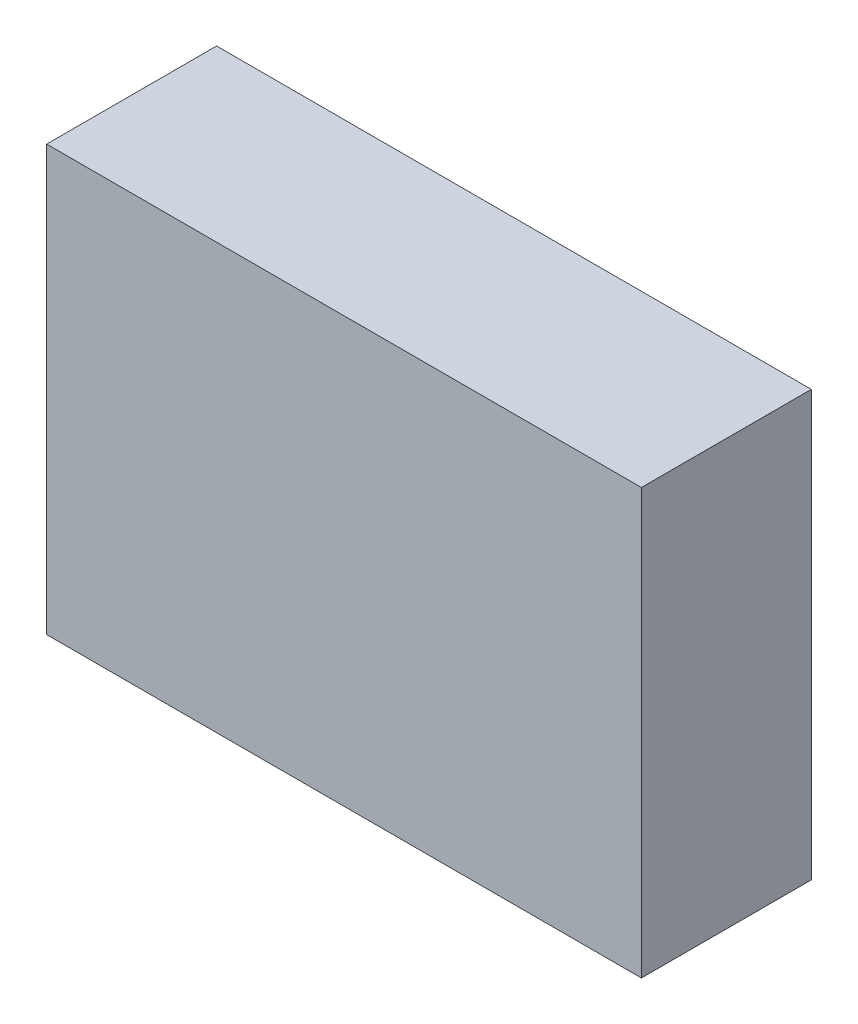
ISO-10303-21;
HEADER;
FILE_DESCRIPTION(('STEP AP214'),'2;1');
FILE_NAME('part.step','',(''),(''),'','','');
FILE_SCHEMA(('AUTOMOTIVE_DESIGN { 1 0 10303 214 1 1 1 1 }'));
ENDSEC;
DATA;
#1=APPLICATION_CONTEXT('core data for automotive mechanical design processes');
#2=APPLICATION_PROTOCOL_DEFINITION('international standard','automotive_design',2000,#1);
#3=PRODUCT_CONTEXT('',#1,'mechanical');
#4=PRODUCT('Part','Part','',(#3));
#5=PRODUCT_RELATED_PRODUCT_CATEGORY('part','',(#4));
#6=PRODUCT_DEFINITION_FORMATION('','',#4);
#7=PRODUCT_DEFINITION_CONTEXT('part definition',#1,'design');
#8=PRODUCT_DEFINITION('design','',#6,#7);
#9=PRODUCT_DEFINITION_SHAPE('','',#8);
#10=(LENGTH_UNIT() NAMED_UNIT(*) SI_UNIT(.MILLI.,.METRE.));
#11=(NAMED_UNIT(*) PLANE_ANGLE_UNIT() SI_UNIT($,.RADIAN.));
#12=(NAMED_UNIT(*) SI_UNIT($,.STERADIAN.) SOLID_ANGLE_UNIT());
#13=UNCERTAINTY_MEASURE_WITH_UNIT(LENGTH_MEASURE(1.E-05),#10,'distance_accuracy_value','');
#14=(GEOMETRIC_REPRESENTATION_CONTEXT(3) GLOBAL_UNCERTAINTY_ASSIGNED_CONTEXT((#13)) GLOBAL_UNIT_ASSIGNED_CONTEXT((#10,
#11,#12)) REPRESENTATION_CONTEXT('',''));
#15=CARTESIAN_POINT('',(0.,0.,0.));
#16=DIRECTION('',(0.,0.,1.));
#17=DIRECTION('',(1.,0.,0.));
#18=AXIS2_PLACEMENT_3D('',#15,#16,#17);
#19=CARTESIAN_POINT('',(35.,-25.,20.));
#20=DIRECTION('',(-1.,0.,0.));
#21=DIRECTION('',(0.,0.,1.));
#22=AXIS2_PLACEMENT_3D('',#19,#20,#21);
#23=PLANE('',#22);
#24=DIRECTION('',(0.,1.,0.));
#25=VECTOR('',#24,1.);
#26=CARTESIAN_POINT('',(35.,-25.,0.));
#27=LINE('',#26,#25);
#28=CARTESIAN_POINT('',(35.,-25.,0.));
#29=VERTEX_POINT('',#28);
#30=CARTESIAN_POINT('',(35.,25.,0.));
#31=VERTEX_POINT('',#30);
#32=EDGE_CURVE('E113',#29,#31,#27,.T.);
#33=ORIENTED_EDGE('',*,*,#32,.T.);
#34=DIRECTION('',(0.,0.,-1.));
#35=VECTOR('',#34,1.);
#36=CARTESIAN_POINT('',(35.,25.,20.));
#37=LINE('',#36,#35);
#38=CARTESIAN_POINT('',(35.,25.,20.));
#39=VERTEX_POINT('',#38);
#40=EDGE_CURVE('E11',#39,#31,#37,.T.);
#41=ORIENTED_EDGE('',*,*,#40,.F.);
#42=DIRECTION('',(0.,1.,0.));
#43=VECTOR('',#42,1.);
#44=CARTESIAN_POINT('',(35.,-25.,20.));
#45=LINE('',#44,#43);
#46=CARTESIAN_POINT('',(35.,-25.,20.));
#47=VERTEX_POINT('',#46);
#48=EDGE_CURVE('E97',#47,#39,#45,.T.);
#49=ORIENTED_EDGE('',*,*,#48,.F.);
#50=DIRECTION('',(0.,0.,-1.));
#51=VECTOR('',#50,1.);
#52=CARTESIAN_POINT('',(35.,-25.,20.));
#53=LINE('',#52,#51);
#54=EDGE_CURVE('E109',#47,#29,#53,.T.);
#55=ORIENTED_EDGE('',*,*,#54,.T.);
#56=EDGE_LOOP('',(#33,#41,#49,#55));
#57=FACE_BOUND('',#56,.T.);
#58=ADVANCED_FACE('F45',(#57),#23,.F.);
#59=CARTESIAN_POINT('',(-35.,25.,20.));
#60=DIRECTION('',(0.,-1.,0.));
#61=DIRECTION('',(0.,0.,-1.));
#62=AXIS2_PLACEMENT_3D('',#59,#60,#61);
#63=PLANE('',#62);
#64=DIRECTION('',(-1.,0.,0.));
#65=VECTOR('',#64,1.);
#66=CARTESIAN_POINT('',(-35.,25.,0.));
#67=LINE('',#66,#65);
#68=CARTESIAN_POINT('',(-35.,25.,0.));
#69=VERTEX_POINT('',#68);
#70=EDGE_CURVE('E102',#31,#69,#67,.T.);
#71=ORIENTED_EDGE('',*,*,#70,.T.);
#72=DIRECTION('',(0.,0.,-1.));
#73=VECTOR('',#72,1.);
#74=CARTESIAN_POINT('',(-35.,25.,20.));
#75=LINE('',#74,#73);
#76=CARTESIAN_POINT('',(-35.,25.,20.));
#77=VERTEX_POINT('',#76);
#78=EDGE_CURVE('E54',#77,#69,#75,.T.);
#79=ORIENTED_EDGE('',*,*,#78,.F.);
#80=DIRECTION('',(-1.,0.,0.));
#81=VECTOR('',#80,1.);
#82=CARTESIAN_POINT('',(-35.,25.,20.));
#83=LINE('',#82,#81);
#84=EDGE_CURVE('E92',#39,#77,#83,.T.);
#85=ORIENTED_EDGE('',*,*,#84,.F.);
#86=ORIENTED_EDGE('',*,*,#40,.T.);
#87=EDGE_LOOP('',(#71,#79,#85,#86));
#88=FACE_BOUND('',#87,.T.);
#89=ADVANCED_FACE('F101',(#88),#63,.F.);
#90=CARTESIAN_POINT('',(-35.,-25.,20.));
#91=DIRECTION('',(1.,0.,0.));
#92=DIRECTION('',(0.,0.,-1.));
#93=AXIS2_PLACEMENT_3D('',#90,#91,#92);
#94=PLANE('',#93);
#95=DIRECTION('',(0.,-1.,0.));
#96=VECTOR('',#95,1.);
#97=CARTESIAN_POINT('',(-35.,-25.,0.));
#98=LINE('',#97,#96);
#99=CARTESIAN_POINT('',(-35.,-25.,0.));
#100=VERTEX_POINT('',#99);
#101=EDGE_CURVE('E79',#69,#100,#98,.T.);
#102=ORIENTED_EDGE('',*,*,#101,.T.);
#103=DIRECTION('',(0.,0.,-1.));
#104=VECTOR('',#103,1.);
#105=CARTESIAN_POINT('',(-35.,-25.,20.));
#106=LINE('',#105,#104);
#107=CARTESIAN_POINT('',(-35.,-25.,20.));
#108=VERTEX_POINT('',#107);
#109=EDGE_CURVE('E104',#108,#100,#106,.T.);
#110=ORIENTED_EDGE('',*,*,#109,.F.);
#111=DIRECTION('',(0.,-1.,0.));
#112=VECTOR('',#111,1.);
#113=CARTESIAN_POINT('',(-35.,-25.,20.));
#114=LINE('',#113,#112);
#115=EDGE_CURVE('E95',#77,#108,#114,.T.);
#116=ORIENTED_EDGE('',*,*,#115,.F.);
#117=ORIENTED_EDGE('',*,*,#78,.T.);
#118=EDGE_LOOP('',(#102,#110,#116,#117));
#119=FACE_BOUND('',#118,.T.);
#120=ADVANCED_FACE('F105',(#119),#94,.F.);
#121=CARTESIAN_POINT('',(-35.,-25.,20.));
#122=DIRECTION('',(0.,1.,0.));
#123=DIRECTION('',(0.,0.,1.));
#124=AXIS2_PLACEMENT_3D('',#121,#122,#123);
#125=PLANE('',#124);
#126=DIRECTION('',(1.,0.,0.));
#127=VECTOR('',#126,1.);
#128=CARTESIAN_POINT('',(-35.,-25.,0.));
#129=LINE('',#128,#127);
#130=EDGE_CURVE('E85',#100,#29,#129,.T.);
#131=ORIENTED_EDGE('',*,*,#130,.T.);
#132=ORIENTED_EDGE('',*,*,#54,.F.);
#133=DIRECTION('',(1.,0.,0.));
#134=VECTOR('',#133,1.);
#135=CARTESIAN_POINT('',(-35.,-25.,20.));
#136=LINE('',#135,#134);
#137=EDGE_CURVE('E62',#108,#47,#136,.T.);
#138=ORIENTED_EDGE('',*,*,#137,.F.);
#139=ORIENTED_EDGE('',*,*,#109,.T.);
#140=EDGE_LOOP('',(#131,#132,#138,#139));
#141=FACE_BOUND('',#140,.T.);
#142=ADVANCED_FACE('F126',(#141),#125,.F.);
#143=CARTESIAN_POINT('',(0.,0.,20.));
#144=DIRECTION('',(0.,0.,-1.));
#145=DIRECTION('',(-1.,0.,0.));
#146=AXIS2_PLACEMENT_3D('',#143,#144,#145);
#147=PLANE('',#146);
#148=ORIENTED_EDGE('',*,*,#48,.T.);
#149=ORIENTED_EDGE('',*,*,#84,.T.);
#150=ORIENTED_EDGE('',*,*,#115,.T.);
#151=ORIENTED_EDGE('',*,*,#137,.T.);
#152=EDGE_LOOP('',(#148,#149,#150,#151));
#153=FACE_BOUND('',#152,.T.);
#154=ADVANCED_FACE('F93',(#153),#147,.F.);
#155=CARTESIAN_POINT('',(0.,0.,0.));
#156=DIRECTION('',(0.,0.,-1.));
#157=DIRECTION('',(-1.,0.,0.));
#158=AXIS2_PLACEMENT_3D('',#155,#156,#157);
#159=PLANE('',#158);
#160=ORIENTED_EDGE('',*,*,#32,.F.);
#161=ORIENTED_EDGE('',*,*,#130,.F.);
#162=ORIENTED_EDGE('',*,*,#101,.F.);
#163=ORIENTED_EDGE('',*,*,#70,.F.);
#164=EDGE_LOOP('',(#160,#161,#162,#163));
#165=FACE_BOUND('',#164,.T.);
#166=ADVANCED_FACE('F129',(#165),#159,.T.);
#167=CLOSED_SHELL('',(#58,#89,#120,#142,#154,#166));
#168=MANIFOLD_SOLID_BREP('B2',#167);
#169=ADVANCED_BREP_SHAPE_REPRESENTATION('',(#18,#168),#14);
#170=SHAPE_DEFINITION_REPRESENTATION(#9,#169);
ENDSEC;
END-ISO-10303-21;
